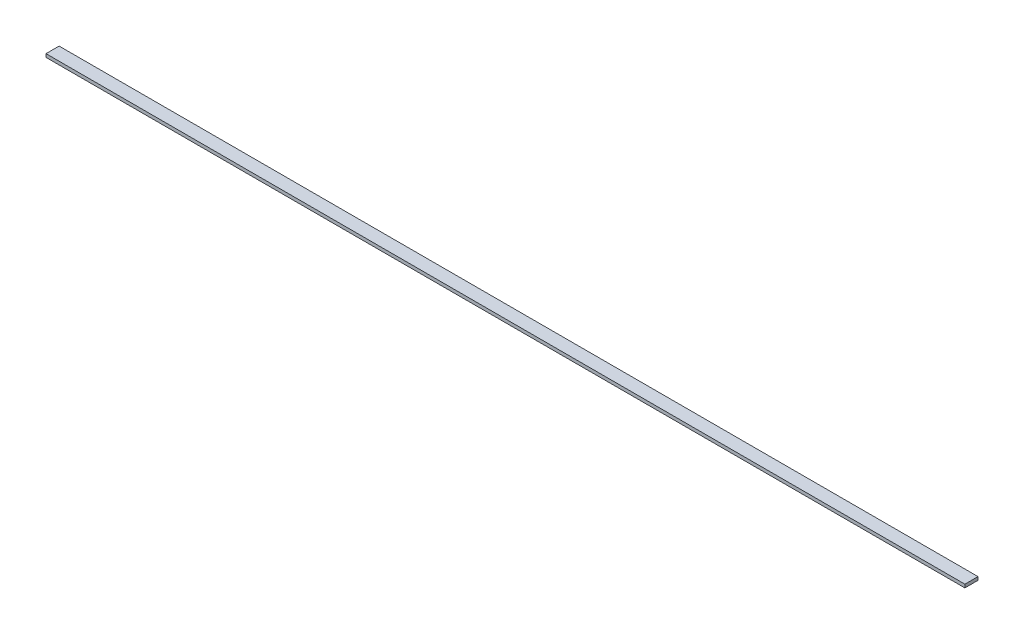
ISO-10303-21;
HEADER;
FILE_DESCRIPTION(('STEP AP214'),'2;1');
FILE_NAME('part.step','',(''),(''),'','','');
FILE_SCHEMA(('AUTOMOTIVE_DESIGN { 1 0 10303 214 1 1 1 1 }'));
ENDSEC;
DATA;
#1=APPLICATION_CONTEXT('core data for automotive mechanical design processes');
#2=APPLICATION_PROTOCOL_DEFINITION('international standard','automotive_design',2000,#1);
#3=PRODUCT_CONTEXT('',#1,'mechanical');
#4=PRODUCT('Part','Part','',(#3));
#5=PRODUCT_RELATED_PRODUCT_CATEGORY('part','',(#4));
#6=PRODUCT_DEFINITION_FORMATION('','',#4);
#7=PRODUCT_DEFINITION_CONTEXT('part definition',#1,'design');
#8=PRODUCT_DEFINITION('design','',#6,#7);
#9=PRODUCT_DEFINITION_SHAPE('','',#8);
#10=(LENGTH_UNIT() NAMED_UNIT(*) SI_UNIT(.MILLI.,.METRE.));
#11=(NAMED_UNIT(*) PLANE_ANGLE_UNIT() SI_UNIT($,.RADIAN.));
#12=(NAMED_UNIT(*) SI_UNIT($,.STERADIAN.) SOLID_ANGLE_UNIT());
#13=UNCERTAINTY_MEASURE_WITH_UNIT(LENGTH_MEASURE(1.E-05),#10,'distance_accuracy_value','');
#14=(GEOMETRIC_REPRESENTATION_CONTEXT(3) GLOBAL_UNCERTAINTY_ASSIGNED_CONTEXT((#13)) GLOBAL_UNIT_ASSIGNED_CONTEXT((#10,
#11,#12)) REPRESENTATION_CONTEXT('',''));
#15=CARTESIAN_POINT('',(0.,0.,0.));
#16=DIRECTION('',(0.,0.,1.));
#17=DIRECTION('',(1.,0.,0.));
#18=AXIS2_PLACEMENT_3D('',#15,#16,#17);
#19=CARTESIAN_POINT('',(889.,6.35,12.7));
#20=DIRECTION('',(-1.,0.,0.));
#21=DIRECTION('',(0.,0.,1.));
#22=AXIS2_PLACEMENT_3D('',#19,#20,#21);
#23=PLANE('',#22);
#24=DIRECTION('',(0.,0.,-1.));
#25=VECTOR('',#24,1.);
#26=CARTESIAN_POINT('',(889.,0.,12.7));
#27=LINE('',#26,#25);
#28=CARTESIAN_POINT('',(889.,0.,12.7));
#29=VERTEX_POINT('',#28);
#30=CARTESIAN_POINT('',(889.,0.,-12.7));
#31=VERTEX_POINT('',#30);
#32=EDGE_CURVE('E98',#29,#31,#27,.T.);
#33=ORIENTED_EDGE('',*,*,#32,.T.);
#34=DIRECTION('',(0.,-1.,0.));
#35=VECTOR('',#34,1.);
#36=CARTESIAN_POINT('',(889.,6.35,-12.7));
#37=LINE('',#36,#35);
#38=CARTESIAN_POINT('',(889.,6.35,-12.7));
#39=VERTEX_POINT('',#38);
#40=EDGE_CURVE('E11',#39,#31,#37,.T.);
#41=ORIENTED_EDGE('',*,*,#40,.F.);
#42=DIRECTION('',(0.,0.,-1.));
#43=VECTOR('',#42,1.);
#44=CARTESIAN_POINT('',(889.,6.35,12.7));
#45=LINE('',#44,#43);
#46=CARTESIAN_POINT('',(889.,6.35,12.7));
#47=VERTEX_POINT('',#46);
#48=EDGE_CURVE('E86',#47,#39,#45,.T.);
#49=ORIENTED_EDGE('',*,*,#48,.F.);
#50=DIRECTION('',(0.,-1.,0.));
#51=VECTOR('',#50,1.);
#52=CARTESIAN_POINT('',(889.,6.35,12.7));
#53=LINE('',#52,#51);
#54=EDGE_CURVE('E94',#47,#29,#53,.T.);
#55=ORIENTED_EDGE('',*,*,#54,.T.);
#56=EDGE_LOOP('',(#33,#41,#49,#55));
#57=FACE_BOUND('',#56,.T.);
#58=ADVANCED_FACE('F35',(#57),#23,.F.);
#59=CARTESIAN_POINT('',(-889.,6.35,-12.7));
#60=DIRECTION('',(0.,0.,1.));
#61=DIRECTION('',(1.,0.,0.));
#62=AXIS2_PLACEMENT_3D('',#59,#60,#61);
#63=PLANE('',#62);
#64=DIRECTION('',(-1.,0.,0.));
#65=VECTOR('',#64,1.);
#66=CARTESIAN_POINT('',(-889.,0.,-12.7));
#67=LINE('',#66,#65);
#68=CARTESIAN_POINT('',(-889.,0.,-12.7));
#69=VERTEX_POINT('',#68);
#70=EDGE_CURVE('E90',#31,#69,#67,.T.);
#71=ORIENTED_EDGE('',*,*,#70,.T.);
#72=DIRECTION('',(0.,-1.,0.));
#73=VECTOR('',#72,1.);
#74=CARTESIAN_POINT('',(-889.,6.35,-12.7));
#75=LINE('',#74,#73);
#76=CARTESIAN_POINT('',(-889.,6.35,-12.7));
#77=VERTEX_POINT('',#76);
#78=EDGE_CURVE('E43',#77,#69,#75,.T.);
#79=ORIENTED_EDGE('',*,*,#78,.F.);
#80=DIRECTION('',(-1.,0.,0.));
#81=VECTOR('',#80,1.);
#82=CARTESIAN_POINT('',(-889.,6.35,-12.7));
#83=LINE('',#82,#81);
#84=EDGE_CURVE('E81',#39,#77,#83,.T.);
#85=ORIENTED_EDGE('',*,*,#84,.F.);
#86=ORIENTED_EDGE('',*,*,#40,.T.);
#87=EDGE_LOOP('',(#71,#79,#85,#86));
#88=FACE_BOUND('',#87,.T.);
#89=ADVANCED_FACE('F89',(#88),#63,.F.);
#90=CARTESIAN_POINT('',(-889.,6.35,12.7));
#91=DIRECTION('',(1.,0.,0.));
#92=DIRECTION('',(0.,0.,-1.));
#93=AXIS2_PLACEMENT_3D('',#90,#91,#92);
#94=PLANE('',#93);
#95=DIRECTION('',(0.,0.,1.));
#96=VECTOR('',#95,1.);
#97=CARTESIAN_POINT('',(-889.,0.,12.7));
#98=LINE('',#97,#96);
#99=CARTESIAN_POINT('',(-889.,0.,12.7));
#100=VERTEX_POINT('',#99);
#101=EDGE_CURVE('E68',#69,#100,#98,.T.);
#102=ORIENTED_EDGE('',*,*,#101,.T.);
#103=DIRECTION('',(0.,-1.,0.));
#104=VECTOR('',#103,1.);
#105=CARTESIAN_POINT('',(-889.,6.35,12.7));
#106=LINE('',#105,#104);
#107=CARTESIAN_POINT('',(-889.,6.35,12.7));
#108=VERTEX_POINT('',#107);
#109=EDGE_CURVE('E91',#108,#100,#106,.T.);
#110=ORIENTED_EDGE('',*,*,#109,.F.);
#111=DIRECTION('',(0.,0.,1.));
#112=VECTOR('',#111,1.);
#113=CARTESIAN_POINT('',(-889.,6.35,12.7));
#114=LINE('',#113,#112);
#115=EDGE_CURVE('E84',#77,#108,#114,.T.);
#116=ORIENTED_EDGE('',*,*,#115,.F.);
#117=ORIENTED_EDGE('',*,*,#78,.T.);
#118=EDGE_LOOP('',(#102,#110,#116,#117));
#119=FACE_BOUND('',#118,.T.);
#120=ADVANCED_FACE('F92',(#119),#94,.F.);
#121=CARTESIAN_POINT('',(-889.,6.35,12.7));
#122=DIRECTION('',(0.,0.,-1.));
#123=DIRECTION('',(-1.,0.,0.));
#124=AXIS2_PLACEMENT_3D('',#121,#122,#123);
#125=PLANE('',#124);
#126=DIRECTION('',(1.,0.,0.));
#127=VECTOR('',#126,1.);
#128=CARTESIAN_POINT('',(-889.,0.,12.7));
#129=LINE('',#128,#127);
#130=EDGE_CURVE('E74',#100,#29,#129,.T.);
#131=ORIENTED_EDGE('',*,*,#130,.T.);
#132=ORIENTED_EDGE('',*,*,#54,.F.);
#133=DIRECTION('',(1.,0.,0.));
#134=VECTOR('',#133,1.);
#135=CARTESIAN_POINT('',(-889.,6.35,12.7));
#136=LINE('',#135,#134);
#137=EDGE_CURVE('E51',#108,#47,#136,.T.);
#138=ORIENTED_EDGE('',*,*,#137,.F.);
#139=ORIENTED_EDGE('',*,*,#109,.T.);
#140=EDGE_LOOP('',(#131,#132,#138,#139));
#141=FACE_BOUND('',#140,.T.);
#142=ADVANCED_FACE('F105',(#141),#125,.F.);
#143=CARTESIAN_POINT('',(0.,6.35,0.));
#144=DIRECTION('',(0.,-1.,0.));
#145=DIRECTION('',(0.,0.,-1.));
#146=AXIS2_PLACEMENT_3D('',#143,#144,#145);
#147=PLANE('',#146);
#148=ORIENTED_EDGE('',*,*,#48,.T.);
#149=ORIENTED_EDGE('',*,*,#84,.T.);
#150=ORIENTED_EDGE('',*,*,#115,.T.);
#151=ORIENTED_EDGE('',*,*,#137,.T.);
#152=EDGE_LOOP('',(#148,#149,#150,#151));
#153=FACE_BOUND('',#152,.T.);
#154=ADVANCED_FACE('F82',(#153),#147,.F.);
#155=CARTESIAN_POINT('',(0.,0.,0.));
#156=DIRECTION('',(0.,-1.,0.));
#157=DIRECTION('',(0.,0.,-1.));
#158=AXIS2_PLACEMENT_3D('',#155,#156,#157);
#159=PLANE('',#158);
#160=ORIENTED_EDGE('',*,*,#32,.F.);
#161=ORIENTED_EDGE('',*,*,#130,.F.);
#162=ORIENTED_EDGE('',*,*,#101,.F.);
#163=ORIENTED_EDGE('',*,*,#70,.F.);
#164=EDGE_LOOP('',(#160,#161,#162,#163));
#165=FACE_BOUND('',#164,.T.);
#166=ADVANCED_FACE('F108',(#165),#159,.T.);
#167=CLOSED_SHELL('',(#58,#89,#120,#142,#154,#166));
#168=MANIFOLD_SOLID_BREP('B2',#167);
#169=ADVANCED_BREP_SHAPE_REPRESENTATION('',(#18,#168),#14);
#170=SHAPE_DEFINITION_REPRESENTATION(#9,#169);
ENDSEC;
END-ISO-10303-21;
